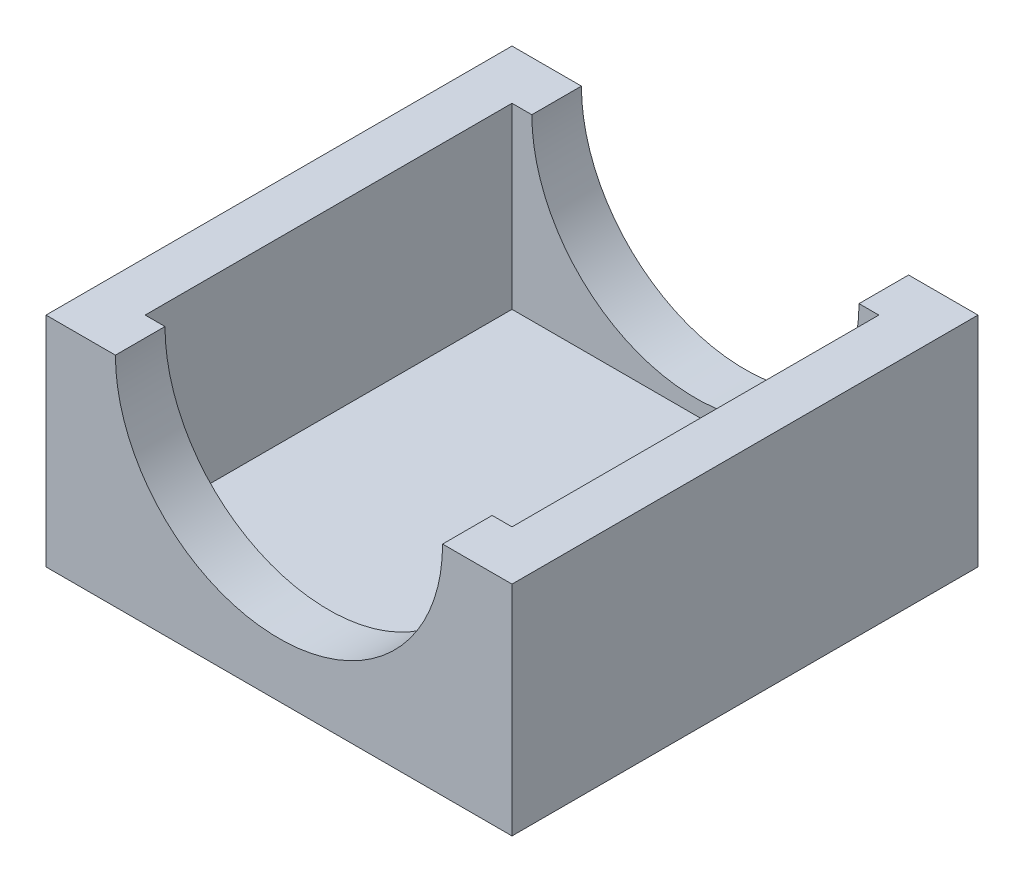
ISO-10303-21;
HEADER;
FILE_DESCRIPTION(('STEP AP214'),'2;1');
FILE_NAME('part.step','',(''),(''),'','','');
FILE_SCHEMA(('AUTOMOTIVE_DESIGN { 1 0 10303 214 1 1 1 1 }'));
ENDSEC;
DATA;
#1=APPLICATION_CONTEXT('core data for automotive mechanical design processes');
#2=APPLICATION_PROTOCOL_DEFINITION('international standard','automotive_design',2000,#1);
#3=PRODUCT_CONTEXT('',#1,'mechanical');
#4=PRODUCT('Part','Part','',(#3));
#5=PRODUCT_RELATED_PRODUCT_CATEGORY('part','',(#4));
#6=PRODUCT_DEFINITION_FORMATION('','',#4);
#7=PRODUCT_DEFINITION_CONTEXT('part definition',#1,'design');
#8=PRODUCT_DEFINITION('design','',#6,#7);
#9=PRODUCT_DEFINITION_SHAPE('','',#8);
#10=(LENGTH_UNIT() NAMED_UNIT(*) SI_UNIT(.MILLI.,.METRE.));
#11=(NAMED_UNIT(*) PLANE_ANGLE_UNIT() SI_UNIT($,.RADIAN.));
#12=(NAMED_UNIT(*) SI_UNIT($,.STERADIAN.) SOLID_ANGLE_UNIT());
#13=UNCERTAINTY_MEASURE_WITH_UNIT(LENGTH_MEASURE(1.E-05),#10,'distance_accuracy_value','');
#14=(GEOMETRIC_REPRESENTATION_CONTEXT(3) GLOBAL_UNCERTAINTY_ASSIGNED_CONTEXT((#13)) GLOBAL_UNIT_ASSIGNED_CONTEXT((#10,
#11,#12)) REPRESENTATION_CONTEXT('',''));
#15=CARTESIAN_POINT('',(0.,0.,0.));
#16=DIRECTION('',(0.,0.,1.));
#17=DIRECTION('',(1.,0.,0.));
#18=AXIS2_PLACEMENT_3D('',#15,#16,#17);
#19=CARTESIAN_POINT('',(0.,34.925,-37.30625));
#20=DIRECTION('',(0.,0.,1.));
#21=DIRECTION('',(1.,0.,0.));
#22=AXIS2_PLACEMENT_3D('',#19,#20,#21);
#23=CYLINDRICAL_SURFACE('',#22,26.19375);
#24=DIRECTION('',(0.,0.,1.));
#25=VECTOR('',#24,1.);
#26=CARTESIAN_POINT('',(26.19375,34.925,-37.30625));
#27=LINE('',#26,#25);
#28=CARTESIAN_POINT('',(26.19375,34.925,37.30625));
#29=VERTEX_POINT('',#28);
#30=CARTESIAN_POINT('',(26.19375,34.925,29.36875));
#31=VERTEX_POINT('',#30);
#32=EDGE_CURVE('E242',#29,#31,#27,.F.);
#33=ORIENTED_EDGE('',*,*,#32,.T.);
#34=CARTESIAN_POINT('',(0.,34.925,29.36875));
#35=DIRECTION('',(0.,0.,1.));
#36=DIRECTION('',(1.,0.,0.));
#37=AXIS2_PLACEMENT_3D('',#34,#35,#36);
#38=CIRCLE('',#37,26.19375);
#39=CARTESIAN_POINT('',(-26.19375,34.925,29.36875));
#40=VERTEX_POINT('',#39);
#41=EDGE_CURVE('E11',#31,#40,#38,.F.);
#42=ORIENTED_EDGE('',*,*,#41,.T.);
#43=DIRECTION('',(0.,0.,1.));
#44=VECTOR('',#43,1.);
#45=CARTESIAN_POINT('',(-26.19375,34.925,-37.30625));
#46=LINE('',#45,#44);
#47=CARTESIAN_POINT('',(-26.19375,34.925,37.30625));
#48=VERTEX_POINT('',#47);
#49=EDGE_CURVE('E245',#40,#48,#46,.T.);
#50=ORIENTED_EDGE('',*,*,#49,.T.);
#51=CARTESIAN_POINT('',(0.,34.925,37.30625));
#52=DIRECTION('',(0.,0.,1.));
#53=DIRECTION('',(1.,0.,0.));
#54=AXIS2_PLACEMENT_3D('',#51,#52,#53);
#55=CIRCLE('',#54,26.19375);
#56=EDGE_CURVE('E69',#48,#29,#55,.T.);
#57=ORIENTED_EDGE('',*,*,#56,.T.);
#58=EDGE_LOOP('',(#33,#42,#50,#57));
#59=FACE_BOUND('',#58,.T.);
#60=ADVANCED_FACE('F45',(#59),#23,.F.);
#61=CARTESIAN_POINT('',(0.,34.925,0.));
#62=DIRECTION('',(0.,1.,0.));
#63=DIRECTION('',(0.,0.,1.));
#64=AXIS2_PLACEMENT_3D('',#61,#62,#63);
#65=PLANE('',#64);
#66=DIRECTION('',(1.,0.,0.));
#67=VECTOR('',#66,1.);
#68=CARTESIAN_POINT('',(-29.36875,34.925,29.36875));
#69=LINE('',#68,#67);
#70=CARTESIAN_POINT('',(-29.36875,34.925,29.36875));
#71=VERTEX_POINT('',#70);
#72=EDGE_CURVE('E162',#71,#40,#69,.T.);
#73=ORIENTED_EDGE('',*,*,#72,.F.);
#74=DIRECTION('',(0.,0.,1.));
#75=VECTOR('',#74,1.);
#76=CARTESIAN_POINT('',(-29.36875,34.925,-29.36875));
#77=LINE('',#76,#75);
#78=CARTESIAN_POINT('',(-29.36875,34.925,-29.36875));
#79=VERTEX_POINT('',#78);
#80=EDGE_CURVE('E177',#79,#71,#77,.T.);
#81=ORIENTED_EDGE('',*,*,#80,.F.);
#82=DIRECTION('',(-1.,0.,0.));
#83=VECTOR('',#82,1.);
#84=CARTESIAN_POINT('',(-29.36875,34.925,-29.36875));
#85=LINE('',#84,#83);
#86=CARTESIAN_POINT('',(-26.19375,34.925,-29.36875));
#87=VERTEX_POINT('',#86);
#88=EDGE_CURVE('E174',#87,#79,#85,.T.);
#89=ORIENTED_EDGE('',*,*,#88,.F.);
#90=CARTESIAN_POINT('',(-26.19375,34.925,-37.30625));
#91=VERTEX_POINT('',#90);
#92=EDGE_CURVE('E246',#91,#87,#46,.T.);
#93=ORIENTED_EDGE('',*,*,#92,.F.);
#94=DIRECTION('',(-1.,0.,0.));
#95=VECTOR('',#94,1.);
#96=CARTESIAN_POINT('',(-37.30625,34.925,-37.30625));
#97=LINE('',#96,#95);
#98=CARTESIAN_POINT('',(-37.30625,34.925,-37.30625));
#99=VERTEX_POINT('',#98);
#100=EDGE_CURVE('E200',#91,#99,#97,.T.);
#101=ORIENTED_EDGE('',*,*,#100,.T.);
#102=DIRECTION('',(0.,0.,1.));
#103=VECTOR('',#102,1.);
#104=CARTESIAN_POINT('',(-37.30625,34.925,-37.30625));
#105=LINE('',#104,#103);
#106=CARTESIAN_POINT('',(-37.30625,34.925,37.30625));
#107=VERTEX_POINT('',#106);
#108=EDGE_CURVE('E206',#99,#107,#105,.T.);
#109=ORIENTED_EDGE('',*,*,#108,.T.);
#110=DIRECTION('',(1.,0.,0.));
#111=VECTOR('',#110,1.);
#112=CARTESIAN_POINT('',(-37.30625,34.925,37.30625));
#113=LINE('',#112,#111);
#114=EDGE_CURVE('E210',#107,#48,#113,.T.);
#115=ORIENTED_EDGE('',*,*,#114,.T.);
#116=ORIENTED_EDGE('',*,*,#49,.F.);
#117=EDGE_LOOP('',(#73,#81,#89,#93,#101,#109,#115,#116));
#118=FACE_BOUND('',#117,.T.);
#119=ADVANCED_FACE('F266',(#118),#65,.T.);
#120=CARTESIAN_POINT('',(37.30625,34.925,-37.30625));
#121=DIRECTION('',(-1.,0.,0.));
#122=DIRECTION('',(0.,0.,1.));
#123=AXIS2_PLACEMENT_3D('',#120,#121,#122);
#124=PLANE('',#123);
#125=DIRECTION('',(0.,0.,-1.));
#126=VECTOR('',#125,1.);
#127=CARTESIAN_POINT('',(37.30625,0.,-37.30625));
#128=LINE('',#127,#126);
#129=CARTESIAN_POINT('',(37.30625,0.,37.30625));
#130=VERTEX_POINT('',#129);
#131=CARTESIAN_POINT('',(37.30625,0.,-37.30625));
#132=VERTEX_POINT('',#131);
#133=EDGE_CURVE('E193',#130,#132,#128,.T.);
#134=ORIENTED_EDGE('',*,*,#133,.T.);
#135=DIRECTION('',(0.,-1.,0.));
#136=VECTOR('',#135,1.);
#137=CARTESIAN_POINT('',(37.30625,34.925,-37.30625));
#138=LINE('',#137,#136);
#139=CARTESIAN_POINT('',(37.30625,34.925,-37.30625));
#140=VERTEX_POINT('',#139);
#141=EDGE_CURVE('E237',#140,#132,#138,.T.);
#142=ORIENTED_EDGE('',*,*,#141,.F.);
#143=DIRECTION('',(0.,0.,-1.));
#144=VECTOR('',#143,1.);
#145=CARTESIAN_POINT('',(37.30625,34.925,-37.30625));
#146=LINE('',#145,#144);
#147=CARTESIAN_POINT('',(37.30625,34.925,37.30625));
#148=VERTEX_POINT('',#147);
#149=EDGE_CURVE('E196',#148,#140,#146,.T.);
#150=ORIENTED_EDGE('',*,*,#149,.F.);
#151=DIRECTION('',(0.,-1.,0.));
#152=VECTOR('',#151,1.);
#153=CARTESIAN_POINT('',(37.30625,34.925,37.30625));
#154=LINE('',#153,#152);
#155=EDGE_CURVE('E214',#148,#130,#154,.T.);
#156=ORIENTED_EDGE('',*,*,#155,.T.);
#157=EDGE_LOOP('',(#134,#142,#150,#156));
#158=FACE_BOUND('',#157,.T.);
#159=ADVANCED_FACE('F47',(#158),#124,.F.);
#160=CARTESIAN_POINT('',(-37.30625,34.925,-37.30625));
#161=DIRECTION('',(0.,0.,1.));
#162=DIRECTION('',(1.,0.,0.));
#163=AXIS2_PLACEMENT_3D('',#160,#161,#162);
#164=PLANE('',#163);
#165=ORIENTED_EDGE('',*,*,#100,.F.);
#166=CARTESIAN_POINT('',(0.,34.925,-37.30625));
#167=DIRECTION('',(0.,0.,1.));
#168=DIRECTION('',(1.,0.,0.));
#169=AXIS2_PLACEMENT_3D('',#166,#167,#168);
#170=CIRCLE('',#169,26.19375);
#171=CARTESIAN_POINT('',(26.19375,34.925,-37.30625));
#172=VERTEX_POINT('',#171);
#173=EDGE_CURVE('E189',#91,#172,#170,.T.);
#174=ORIENTED_EDGE('',*,*,#173,.T.);
#175=EDGE_CURVE('E202',#140,#172,#97,.T.);
#176=ORIENTED_EDGE('',*,*,#175,.F.);
#177=ORIENTED_EDGE('',*,*,#141,.T.);
#178=DIRECTION('',(-1.,0.,0.));
#179=VECTOR('',#178,1.);
#180=CARTESIAN_POINT('',(-37.30625,0.,-37.30625));
#181=LINE('',#180,#179);
#182=CARTESIAN_POINT('',(-37.30625,0.,-37.30625));
#183=VERTEX_POINT('',#182);
#184=EDGE_CURVE('E218',#132,#183,#181,.T.);
#185=ORIENTED_EDGE('',*,*,#184,.T.);
#186=DIRECTION('',(0.,-1.,0.));
#187=VECTOR('',#186,1.);
#188=CARTESIAN_POINT('',(-37.30625,34.925,-37.30625));
#189=LINE('',#188,#187);
#190=EDGE_CURVE('E233',#99,#183,#189,.T.);
#191=ORIENTED_EDGE('',*,*,#190,.F.);
#192=EDGE_LOOP('',(#165,#174,#176,#177,#185,#191));
#193=FACE_BOUND('',#192,.T.);
#194=ADVANCED_FACE('F270',(#193),#164,.F.);
#195=CARTESIAN_POINT('',(-37.30625,34.925,-37.30625));
#196=DIRECTION('',(1.,0.,0.));
#197=DIRECTION('',(0.,0.,-1.));
#198=AXIS2_PLACEMENT_3D('',#195,#196,#197);
#199=PLANE('',#198);
#200=DIRECTION('',(0.,0.,1.));
#201=VECTOR('',#200,1.);
#202=CARTESIAN_POINT('',(-37.30625,0.,-37.30625));
#203=LINE('',#202,#201);
#204=CARTESIAN_POINT('',(-37.30625,0.,37.30625));
#205=VERTEX_POINT('',#204);
#206=EDGE_CURVE('E221',#183,#205,#203,.T.);
#207=ORIENTED_EDGE('',*,*,#206,.T.);
#208=DIRECTION('',(0.,-1.,0.));
#209=VECTOR('',#208,1.);
#210=CARTESIAN_POINT('',(-37.30625,34.925,37.30625));
#211=LINE('',#210,#209);
#212=EDGE_CURVE('E229',#107,#205,#211,.T.);
#213=ORIENTED_EDGE('',*,*,#212,.F.);
#214=ORIENTED_EDGE('',*,*,#108,.F.);
#215=ORIENTED_EDGE('',*,*,#190,.T.);
#216=EDGE_LOOP('',(#207,#213,#214,#215));
#217=FACE_BOUND('',#216,.T.);
#218=ADVANCED_FACE('F273',(#217),#199,.F.);
#219=CARTESIAN_POINT('',(-37.30625,34.925,37.30625));
#220=DIRECTION('',(0.,0.,-1.));
#221=DIRECTION('',(-1.,0.,0.));
#222=AXIS2_PLACEMENT_3D('',#219,#220,#221);
#223=PLANE('',#222);
#224=EDGE_CURVE('E209',#29,#148,#113,.T.);
#225=ORIENTED_EDGE('',*,*,#224,.F.);
#226=ORIENTED_EDGE('',*,*,#56,.F.);
#227=ORIENTED_EDGE('',*,*,#114,.F.);
#228=ORIENTED_EDGE('',*,*,#212,.T.);
#229=DIRECTION('',(1.,0.,0.));
#230=VECTOR('',#229,1.);
#231=CARTESIAN_POINT('',(-37.30625,0.,37.30625));
#232=LINE('',#231,#230);
#233=EDGE_CURVE('E201',#205,#130,#232,.T.);
#234=ORIENTED_EDGE('',*,*,#233,.T.);
#235=ORIENTED_EDGE('',*,*,#155,.F.);
#236=EDGE_LOOP('',(#225,#226,#227,#228,#234,#235));
#237=FACE_BOUND('',#236,.T.);
#238=ADVANCED_FACE('F278',(#237),#223,.F.);
#239=CARTESIAN_POINT('',(29.36875,34.925,29.36875));
#240=VERTEX_POINT('',#239);
#241=EDGE_CURVE('E165',#31,#240,#69,.T.);
#242=ORIENTED_EDGE('',*,*,#241,.F.);
#243=ORIENTED_EDGE('',*,*,#32,.F.);
#244=ORIENTED_EDGE('',*,*,#224,.T.);
#245=ORIENTED_EDGE('',*,*,#149,.T.);
#246=ORIENTED_EDGE('',*,*,#175,.T.);
#247=CARTESIAN_POINT('',(26.19375,34.925,-29.36875));
#248=VERTEX_POINT('',#247);
#249=EDGE_CURVE('E241',#248,#172,#27,.F.);
#250=ORIENTED_EDGE('',*,*,#249,.F.);
#251=CARTESIAN_POINT('',(29.36875,34.925,-29.36875));
#252=VERTEX_POINT('',#251);
#253=EDGE_CURVE('E61',#252,#248,#85,.T.);
#254=ORIENTED_EDGE('',*,*,#253,.F.);
#255=DIRECTION('',(0.,0.,-1.));
#256=VECTOR('',#255,1.);
#257=CARTESIAN_POINT('',(29.36875,34.925,-29.36875));
#258=LINE('',#257,#256);
#259=EDGE_CURVE('E144',#240,#252,#258,.T.);
#260=ORIENTED_EDGE('',*,*,#259,.F.);
#261=EDGE_LOOP('',(#242,#243,#244,#245,#246,#250,#254,#260));
#262=FACE_BOUND('',#261,.T.);
#263=ADVANCED_FACE('F257',(#262),#65,.T.);
#264=CARTESIAN_POINT('',(0.,0.,0.));
#265=DIRECTION('',(0.,1.,0.));
#266=DIRECTION('',(0.,0.,1.));
#267=AXIS2_PLACEMENT_3D('',#264,#265,#266);
#268=PLANE('',#267);
#269=ORIENTED_EDGE('',*,*,#133,.F.);
#270=ORIENTED_EDGE('',*,*,#233,.F.);
#271=ORIENTED_EDGE('',*,*,#206,.F.);
#272=ORIENTED_EDGE('',*,*,#184,.F.);
#273=EDGE_LOOP('',(#269,#270,#271,#272));
#274=FACE_BOUND('',#273,.T.);
#275=ADVANCED_FACE('F305',(#274),#268,.F.);
#276=ORIENTED_EDGE('',*,*,#92,.T.);
#277=CARTESIAN_POINT('',(0.,34.925,-29.36875));
#278=DIRECTION('',(0.,0.,-1.));
#279=DIRECTION('',(-1.,0.,0.));
#280=AXIS2_PLACEMENT_3D('',#277,#278,#279);
#281=CIRCLE('',#280,26.19375);
#282=EDGE_CURVE('E54',#87,#248,#281,.F.);
#283=ORIENTED_EDGE('',*,*,#282,.T.);
#284=ORIENTED_EDGE('',*,*,#249,.T.);
#285=ORIENTED_EDGE('',*,*,#173,.F.);
#286=EDGE_LOOP('',(#276,#283,#284,#285));
#287=FACE_BOUND('',#286,.T.);
#288=ADVANCED_FACE('F252',(#287),#23,.F.);
#289=CARTESIAN_POINT('',(-29.36875,6.35,29.36875));
#290=DIRECTION('',(0.,0.,1.));
#291=DIRECTION('',(1.,0.,0.));
#292=AXIS2_PLACEMENT_3D('',#289,#290,#291);
#293=PLANE('',#292);
#294=ORIENTED_EDGE('',*,*,#241,.T.);
#295=DIRECTION('',(0.,1.,0.));
#296=VECTOR('',#295,1.);
#297=CARTESIAN_POINT('',(29.36875,6.35,29.36875));
#298=LINE('',#297,#296);
#299=CARTESIAN_POINT('',(29.36875,6.35,29.36875));
#300=VERTEX_POINT('',#299);
#301=EDGE_CURVE('E181',#300,#240,#298,.T.);
#302=ORIENTED_EDGE('',*,*,#301,.F.);
#303=DIRECTION('',(1.,0.,0.));
#304=VECTOR('',#303,1.);
#305=CARTESIAN_POINT('',(-29.36875,6.35,29.36875));
#306=LINE('',#305,#304);
#307=CARTESIAN_POINT('',(-29.36875,6.35,29.36875));
#308=VERTEX_POINT('',#307);
#309=EDGE_CURVE('E147',#308,#300,#306,.T.);
#310=ORIENTED_EDGE('',*,*,#309,.F.);
#311=DIRECTION('',(0.,1.,0.));
#312=VECTOR('',#311,1.);
#313=CARTESIAN_POINT('',(-29.36875,6.35,29.36875));
#314=LINE('',#313,#312);
#315=EDGE_CURVE('E184',#308,#71,#314,.T.);
#316=ORIENTED_EDGE('',*,*,#315,.T.);
#317=ORIENTED_EDGE('',*,*,#72,.T.);
#318=ORIENTED_EDGE('',*,*,#41,.F.);
#319=EDGE_LOOP('',(#294,#302,#310,#316,#317,#318));
#320=FACE_BOUND('',#319,.T.);
#321=ADVANCED_FACE('F282',(#320),#293,.F.);
#322=CARTESIAN_POINT('',(-29.36875,6.35,-29.36875));
#323=DIRECTION('',(0.,0.,-1.));
#324=DIRECTION('',(-1.,0.,0.));
#325=AXIS2_PLACEMENT_3D('',#322,#323,#324);
#326=PLANE('',#325);
#327=ORIENTED_EDGE('',*,*,#88,.T.);
#328=DIRECTION('',(0.,1.,0.));
#329=VECTOR('',#328,1.);
#330=CARTESIAN_POINT('',(-29.36875,6.35,-29.36875));
#331=LINE('',#330,#329);
#332=CARTESIAN_POINT('',(-29.36875,6.35,-29.36875));
#333=VERTEX_POINT('',#332);
#334=EDGE_CURVE('E146',#333,#79,#331,.T.);
#335=ORIENTED_EDGE('',*,*,#334,.F.);
#336=DIRECTION('',(-1.,0.,0.));
#337=VECTOR('',#336,1.);
#338=CARTESIAN_POINT('',(-29.36875,6.35,-29.36875));
#339=LINE('',#338,#337);
#340=CARTESIAN_POINT('',(29.36875,6.35,-29.36875));
#341=VERTEX_POINT('',#340);
#342=EDGE_CURVE('E150',#341,#333,#339,.T.);
#343=ORIENTED_EDGE('',*,*,#342,.F.);
#344=DIRECTION('',(0.,1.,0.));
#345=VECTOR('',#344,1.);
#346=CARTESIAN_POINT('',(29.36875,6.35,-29.36875));
#347=LINE('',#346,#345);
#348=EDGE_CURVE('E136',#341,#252,#347,.T.);
#349=ORIENTED_EDGE('',*,*,#348,.T.);
#350=ORIENTED_EDGE('',*,*,#253,.T.);
#351=ORIENTED_EDGE('',*,*,#282,.F.);
#352=EDGE_LOOP('',(#327,#335,#343,#349,#350,#351));
#353=FACE_BOUND('',#352,.T.);
#354=ADVANCED_FACE('F151',(#353),#326,.F.);
#355=CARTESIAN_POINT('',(29.36875,6.35,-29.36875));
#356=DIRECTION('',(1.,0.,0.));
#357=DIRECTION('',(0.,0.,-1.));
#358=AXIS2_PLACEMENT_3D('',#355,#356,#357);
#359=PLANE('',#358);
#360=ORIENTED_EDGE('',*,*,#259,.T.);
#361=ORIENTED_EDGE('',*,*,#348,.F.);
#362=DIRECTION('',(0.,0.,-1.));
#363=VECTOR('',#362,1.);
#364=CARTESIAN_POINT('',(29.36875,6.35,-29.36875));
#365=LINE('',#364,#363);
#366=EDGE_CURVE('E141',#300,#341,#365,.T.);
#367=ORIENTED_EDGE('',*,*,#366,.F.);
#368=ORIENTED_EDGE('',*,*,#301,.T.);
#369=EDGE_LOOP('',(#360,#361,#367,#368));
#370=FACE_BOUND('',#369,.T.);
#371=ADVANCED_FACE('F138',(#370),#359,.F.);
#372=CARTESIAN_POINT('',(-29.36875,6.35,-29.36875));
#373=DIRECTION('',(-1.,0.,0.));
#374=DIRECTION('',(0.,0.,1.));
#375=AXIS2_PLACEMENT_3D('',#372,#373,#374);
#376=PLANE('',#375);
#377=ORIENTED_EDGE('',*,*,#80,.T.);
#378=ORIENTED_EDGE('',*,*,#315,.F.);
#379=DIRECTION('',(0.,0.,1.));
#380=VECTOR('',#379,1.);
#381=CARTESIAN_POINT('',(-29.36875,6.35,-29.36875));
#382=LINE('',#381,#380);
#383=EDGE_CURVE('E157',#333,#308,#382,.T.);
#384=ORIENTED_EDGE('',*,*,#383,.F.);
#385=ORIENTED_EDGE('',*,*,#334,.T.);
#386=EDGE_LOOP('',(#377,#378,#384,#385));
#387=FACE_BOUND('',#386,.T.);
#388=ADVANCED_FACE('F286',(#387),#376,.F.);
#389=CARTESIAN_POINT('',(0.,6.35,0.));
#390=DIRECTION('',(0.,1.,0.));
#391=DIRECTION('',(0.,0.,1.));
#392=AXIS2_PLACEMENT_3D('',#389,#390,#391);
#393=PLANE('',#392);
#394=ORIENTED_EDGE('',*,*,#366,.T.);
#395=ORIENTED_EDGE('',*,*,#342,.T.);
#396=ORIENTED_EDGE('',*,*,#383,.T.);
#397=ORIENTED_EDGE('',*,*,#309,.T.);
#398=EDGE_LOOP('',(#394,#395,#396,#397));
#399=FACE_BOUND('',#398,.T.);
#400=ADVANCED_FACE('F159',(#399),#393,.T.);
#401=CLOSED_SHELL('',(#60,#119,#159,#194,#218,#238,#263,#275,#288,#321,#354,#371,#388,#400));
#402=MANIFOLD_SOLID_BREP('B2',#401);
#403=ADVANCED_BREP_SHAPE_REPRESENTATION('',(#18,#402),#14);
#404=SHAPE_DEFINITION_REPRESENTATION(#9,#403);
ENDSEC;
END-ISO-10303-21;
